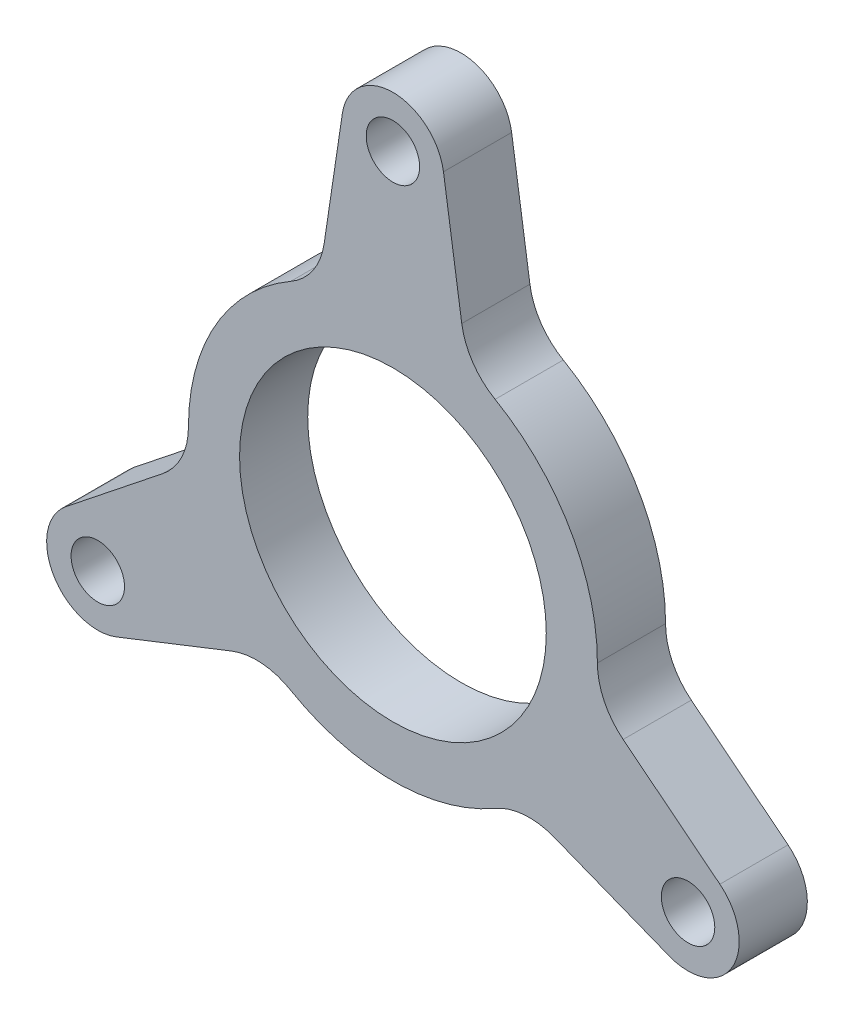
ISO-10303-21;
HEADER;
FILE_DESCRIPTION(('STEP AP214'),'2;1');
FILE_NAME('part.step','',(''),(''),'','','');
FILE_SCHEMA(('AUTOMOTIVE_DESIGN { 1 0 10303 214 1 1 1 1 }'));
ENDSEC;
DATA;
#1=APPLICATION_CONTEXT('core data for automotive mechanical design processes');
#2=APPLICATION_PROTOCOL_DEFINITION('international standard','automotive_design',2000,#1);
#3=PRODUCT_CONTEXT('',#1,'mechanical');
#4=PRODUCT('Part','Part','',(#3));
#5=PRODUCT_RELATED_PRODUCT_CATEGORY('part','',(#4));
#6=PRODUCT_DEFINITION_FORMATION('','',#4);
#7=PRODUCT_DEFINITION_CONTEXT('part definition',#1,'design');
#8=PRODUCT_DEFINITION('design','',#6,#7);
#9=PRODUCT_DEFINITION_SHAPE('','',#8);
#10=(LENGTH_UNIT() NAMED_UNIT(*) SI_UNIT(.MILLI.,.METRE.));
#11=(NAMED_UNIT(*) PLANE_ANGLE_UNIT() SI_UNIT($,.RADIAN.));
#12=(NAMED_UNIT(*) SI_UNIT($,.STERADIAN.) SOLID_ANGLE_UNIT());
#13=UNCERTAINTY_MEASURE_WITH_UNIT(LENGTH_MEASURE(1.E-05),#10,'distance_accuracy_value','');
#14=(GEOMETRIC_REPRESENTATION_CONTEXT(3) GLOBAL_UNCERTAINTY_ASSIGNED_CONTEXT((#13)) GLOBAL_UNIT_ASSIGNED_CONTEXT((#10,
#11,#12)) REPRESENTATION_CONTEXT('',''));
#15=CARTESIAN_POINT('',(0.,0.,0.));
#16=DIRECTION('',(0.,0.,1.));
#17=DIRECTION('',(1.,0.,0.));
#18=AXIS2_PLACEMENT_3D('',#15,#16,#17);
#19=CARTESIAN_POINT('',(0.,0.,6.35));
#20=DIRECTION('',(0.,0.,-1.));
#21=DIRECTION('',(-1.,0.,0.));
#22=AXIS2_PLACEMENT_3D('',#19,#20,#21);
#23=CYLINDRICAL_SURFACE('',#22,19.05);
#24=CARTESIAN_POINT('',(0.,0.,6.35));
#25=DIRECTION('',(0.,0.,1.));
#26=DIRECTION('',(1.,0.,0.));
#27=AXIS2_PLACEMENT_3D('',#24,#25,#26);
#28=CIRCLE('',#27,19.05);
#29=CARTESIAN_POINT('',(19.0499990058117,-0.00615455702048483,6.35));
#30=VERTEX_POINT('',#29);
#31=CARTESIAN_POINT('',(9.51966950017709,16.5008603596115,6.35));
#32=VERTEX_POINT('',#31);
#33=EDGE_CURVE('E185',#30,#32,#28,.T.);
#34=ORIENTED_EDGE('',*,*,#33,.F.);
#35=DIRECTION('',(0.,0.,-1.));
#36=VECTOR('',#35,1.);
#37=CARTESIAN_POINT('',(19.0499990058117,-0.00615455702048483,6.35));
#38=LINE('',#37,#36);
#39=CARTESIAN_POINT('',(19.0499990058117,-0.00615455702048483,0.));
#40=VERTEX_POINT('',#39);
#41=EDGE_CURVE('E269',#30,#40,#38,.T.);
#42=ORIENTED_EDGE('',*,*,#41,.T.);
#43=CARTESIAN_POINT('',(0.,0.,0.));
#44=DIRECTION('',(0.,0.,1.));
#45=DIRECTION('',(1.,0.,0.));
#46=AXIS2_PLACEMENT_3D('',#43,#44,#45);
#47=CIRCLE('',#46,19.05);
#48=CARTESIAN_POINT('',(9.51966950017709,16.5008603596115,0.));
#49=VERTEX_POINT('',#48);
#50=EDGE_CURVE('E222',#40,#49,#47,.T.);
#51=ORIENTED_EDGE('',*,*,#50,.T.);
#52=DIRECTION('',(0.,0.,-1.));
#53=VECTOR('',#52,1.);
#54=CARTESIAN_POINT('',(9.51966950017709,16.5008603596115,6.35));
#55=LINE('',#54,#53);
#56=EDGE_CURVE('E171',#49,#32,#55,.F.);
#57=ORIENTED_EDGE('',*,*,#56,.T.);
#58=EDGE_LOOP('',(#34,#42,#51,#57));
#59=FACE_BOUND('',#58,.T.);
#60=ADVANCED_FACE('F39',(#59),#23,.T.);
#61=CARTESIAN_POINT('',(9.3515888617346,1.39760431959159,6.35));
#62=DIRECTION('',(0.989015863361917,0.147809411129611,0.));
#63=DIRECTION('',(-0.147809411129611,0.989015863361917,0.));
#64=AXIS2_PLACEMENT_3D('',#61,#62,#63);
#65=PLANE('',#64);
#66=DIRECTION('',(0.147809411129611,-0.989015863361917,0.));
#67=VECTOR('',#66,1.);
#68=CARTESIAN_POINT('',(9.3515888617346,1.39760431959159,6.35));
#69=LINE('',#68,#67);
#70=CARTESIAN_POINT('',(4.71018804926113,32.4539423205048,6.35));
#71=VERTEX_POINT('',#70);
#72=CARTESIAN_POINT('',(6.41264193455461,21.0625573854756,6.35));
#73=VERTEX_POINT('',#72);
#74=EDGE_CURVE('E166',#71,#73,#69,.T.);
#75=ORIENTED_EDGE('',*,*,#74,.T.);
#76=DIRECTION('',(0.,0.,-1.));
#77=VECTOR('',#76,1.);
#78=CARTESIAN_POINT('',(6.41264193455461,21.0625573854756,6.35));
#79=LINE('',#78,#77);
#80=CARTESIAN_POINT('',(6.41264193455461,21.0625573854756,0.));
#81=VERTEX_POINT('',#80);
#82=EDGE_CURVE('E294',#73,#81,#79,.T.);
#83=ORIENTED_EDGE('',*,*,#82,.T.);
#84=DIRECTION('',(0.147809411129611,-0.989015863361917,0.));
#85=VECTOR('',#84,1.);
#86=CARTESIAN_POINT('',(9.3515888617346,1.39760431959159,0.));
#87=LINE('',#86,#85);
#88=CARTESIAN_POINT('',(4.71018804926113,32.4539423205048,0.));
#89=VERTEX_POINT('',#88);
#90=EDGE_CURVE('E168',#89,#81,#87,.T.);
#91=ORIENTED_EDGE('',*,*,#90,.F.);
#92=DIRECTION('',(0.,0.,-1.));
#93=VECTOR('',#92,1.);
#94=CARTESIAN_POINT('',(4.71018804926113,32.4539423205048,6.35));
#95=LINE('',#94,#93);
#96=EDGE_CURVE('E163',#71,#89,#95,.T.);
#97=ORIENTED_EDGE('',*,*,#96,.F.);
#98=EDGE_LOOP('',(#75,#83,#91,#97));
#99=FACE_BOUND('',#98,.T.);
#100=ADVANCED_FACE('F165',(#99),#65,.T.);
#101=CARTESIAN_POINT('',(0.,31.75,6.35));
#102=DIRECTION('',(0.,0.,-1.));
#103=DIRECTION('',(-1.,0.,0.));
#104=AXIS2_PLACEMENT_3D('',#101,#102,#103);
#105=CYLINDRICAL_SURFACE('',#104,4.7625);
#106=CARTESIAN_POINT('',(0.,31.75,0.));
#107=DIRECTION('',(0.,0.,1.));
#108=DIRECTION('',(1.,0.,0.));
#109=AXIS2_PLACEMENT_3D('',#106,#107,#108);
#110=CIRCLE('',#109,4.7625);
#111=CARTESIAN_POINT('',(-4.71018804926113,32.4539423205048,0.));
#112=VERTEX_POINT('',#111);
#113=EDGE_CURVE('E230',#89,#112,#110,.T.);
#114=ORIENTED_EDGE('',*,*,#113,.T.);
#115=DIRECTION('',(0.,0.,-1.));
#116=VECTOR('',#115,1.);
#117=CARTESIAN_POINT('',(-4.71018804926113,32.4539423205048,6.35));
#118=LINE('',#117,#116);
#119=CARTESIAN_POINT('',(-4.71018804926113,32.4539423205048,6.35));
#120=VERTEX_POINT('',#119);
#121=EDGE_CURVE('E172',#120,#112,#118,.T.);
#122=ORIENTED_EDGE('',*,*,#121,.F.);
#123=CARTESIAN_POINT('',(0.,31.75,6.35));
#124=DIRECTION('',(0.,0.,1.));
#125=DIRECTION('',(1.,0.,0.));
#126=AXIS2_PLACEMENT_3D('',#123,#124,#125);
#127=CIRCLE('',#126,4.7625);
#128=EDGE_CURVE('E175',#71,#120,#127,.T.);
#129=ORIENTED_EDGE('',*,*,#128,.F.);
#130=ORIENTED_EDGE('',*,*,#96,.T.);
#131=EDGE_LOOP('',(#114,#122,#129,#130));
#132=FACE_BOUND('',#131,.T.);
#133=ADVANCED_FACE('F176',(#132),#105,.T.);
#134=CARTESIAN_POINT('',(-9.35158886173458,1.39760431959158,6.35));
#135=DIRECTION('',(0.989015863361917,-0.147809411129611,0.));
#136=DIRECTION('',(0.147809411129611,0.989015863361917,0.));
#137=AXIS2_PLACEMENT_3D('',#134,#135,#136);
#138=PLANE('',#137);
#139=DIRECTION('',(-0.147809411129611,-0.989015863361917,0.));
#140=VECTOR('',#139,1.);
#141=CARTESIAN_POINT('',(-9.35158886173458,1.39760431959158,0.));
#142=LINE('',#141,#140);
#143=CARTESIAN_POINT('',(-6.4126419345546,21.0625573854756,0.));
#144=VERTEX_POINT('',#143);
#145=EDGE_CURVE('E227',#112,#144,#142,.T.);
#146=ORIENTED_EDGE('',*,*,#145,.T.);
#147=DIRECTION('',(0.,0.,1.));
#148=VECTOR('',#147,1.);
#149=CARTESIAN_POINT('',(-6.4126419345546,21.0625573854756,6.35));
#150=LINE('',#149,#148);
#151=CARTESIAN_POINT('',(-6.4126419345546,21.0625573854756,6.35));
#152=VERTEX_POINT('',#151);
#153=EDGE_CURVE('E292',#144,#152,#150,.T.);
#154=ORIENTED_EDGE('',*,*,#153,.T.);
#155=DIRECTION('',(-0.147809411129611,-0.989015863361917,0.));
#156=VECTOR('',#155,1.);
#157=CARTESIAN_POINT('',(-9.35158886173458,1.39760431959158,6.35));
#158=LINE('',#157,#156);
#159=EDGE_CURVE('E180',#120,#152,#158,.T.);
#160=ORIENTED_EDGE('',*,*,#159,.F.);
#161=ORIENTED_EDGE('',*,*,#121,.T.);
#162=EDGE_LOOP('',(#146,#154,#160,#161));
#163=FACE_BOUND('',#162,.T.);
#164=ADVANCED_FACE('F342',(#163),#138,.F.);
#165=CARTESIAN_POINT('',(-9.51966950017708,16.5008603596115,0.));
#166=VERTEX_POINT('',#165);
#167=CARTESIAN_POINT('',(-19.0499990058117,-0.00615455702049654,0.));
#168=VERTEX_POINT('',#167);
#169=EDGE_CURVE('E223',#166,#168,#47,.T.);
#170=ORIENTED_EDGE('',*,*,#169,.T.);
#171=DIRECTION('',(0.,0.,-1.));
#172=VECTOR('',#171,1.);
#173=CARTESIAN_POINT('',(-19.0499990058117,-0.00615455702049654,6.35));
#174=LINE('',#173,#172);
#175=CARTESIAN_POINT('',(-19.0499990058117,-0.00615455702049654,6.35));
#176=VERTEX_POINT('',#175);
#177=EDGE_CURVE('E290',#168,#176,#174,.F.);
#178=ORIENTED_EDGE('',*,*,#177,.T.);
#179=CARTESIAN_POINT('',(-9.51966950017708,16.5008603596115,6.35));
#180=VERTEX_POINT('',#179);
#181=EDGE_CURVE('E189',#180,#176,#28,.T.);
#182=ORIENTED_EDGE('',*,*,#181,.F.);
#183=DIRECTION('',(0.,0.,-1.));
#184=VECTOR('',#183,1.);
#185=CARTESIAN_POINT('',(-9.51966950017708,16.5008603596115,6.35));
#186=LINE('',#185,#184);
#187=EDGE_CURVE('E287',#180,#166,#186,.T.);
#188=ORIENTED_EDGE('',*,*,#187,.T.);
#189=EDGE_LOOP('',(#170,#178,#182,#188));
#190=FACE_BOUND('',#189,.T.);
#191=ADVANCED_FACE('F332',(#190),#23,.T.);
#192=CARTESIAN_POINT('',(-5.88615527607248,7.39991136021396,6.35));
#193=DIRECTION('',(-0.62251463663762,0.782608156852413,0.));
#194=DIRECTION('',(-0.782608156852413,-0.62251463663762,0.));
#195=AXIS2_PLACEMENT_3D('',#192,#193,#194);
#196=PLANE('',#195);
#197=DIRECTION('',(0.782608156852413,0.62251463663762,0.));
#198=VECTOR('',#197,1.);
#199=CARTESIAN_POINT('',(-5.88615527607248,7.39991136021396,6.35));
#200=LINE('',#199,#198);
#201=CARTESIAN_POINT('',(-30.4610325271426,-12.1478286529904,6.35));
#202=VERTEX_POINT('',#201);
#203=CARTESIAN_POINT('',(-21.4470307317668,-4.97776787204015,6.35));
#204=VERTEX_POINT('',#203);
#205=EDGE_CURVE('E194',#202,#204,#200,.T.);
#206=ORIENTED_EDGE('',*,*,#205,.T.);
#207=DIRECTION('',(0.,0.,-1.));
#208=VECTOR('',#207,1.);
#209=CARTESIAN_POINT('',(-21.4470307317668,-4.97776787204015,6.35));
#210=LINE('',#209,#208);
#211=CARTESIAN_POINT('',(-21.4470307317668,-4.97776787204015,0.));
#212=VERTEX_POINT('',#211);
#213=EDGE_CURVE('E284',#204,#212,#210,.T.);
#214=ORIENTED_EDGE('',*,*,#213,.T.);
#215=DIRECTION('',(0.782608156852413,0.62251463663762,0.));
#216=VECTOR('',#215,1.);
#217=CARTESIAN_POINT('',(-5.88615527607248,7.39991136021396,0.));
#218=LINE('',#217,#216);
#219=CARTESIAN_POINT('',(-30.4610325271426,-12.1478286529904,0.));
#220=VERTEX_POINT('',#219);
#221=EDGE_CURVE('E226',#220,#212,#218,.T.);
#222=ORIENTED_EDGE('',*,*,#221,.F.);
#223=DIRECTION('',(0.,0.,-1.));
#224=VECTOR('',#223,1.);
#225=CARTESIAN_POINT('',(-30.4610325271426,-12.1478286529904,6.35));
#226=LINE('',#225,#224);
#227=EDGE_CURVE('E265',#202,#220,#226,.T.);
#228=ORIENTED_EDGE('',*,*,#227,.F.);
#229=EDGE_LOOP('',(#206,#214,#222,#228));
#230=FACE_BOUND('',#229,.T.);
#231=ADVANCED_FACE('F341',(#230),#196,.T.);
#232=CARTESIAN_POINT('',(-27.4963065701559,-15.875,6.35));
#233=DIRECTION('',(0.,0.,-1.));
#234=DIRECTION('',(-1.,0.,0.));
#235=AXIS2_PLACEMENT_3D('',#232,#233,#234);
#236=CYLINDRICAL_SURFACE('',#235,4.7625);
#237=CARTESIAN_POINT('',(-27.4963065701559,-15.875,0.));
#238=DIRECTION('',(0.,0.,1.));
#239=DIRECTION('',(1.,0.,0.));
#240=AXIS2_PLACEMENT_3D('',#237,#238,#239);
#241=CIRCLE('',#240,4.7625);
#242=CARTESIAN_POINT('',(-25.7508444778815,-20.3061136675144,0.));
#243=VERTEX_POINT('',#242);
#244=EDGE_CURVE('E236',#220,#243,#241,.T.);
#245=ORIENTED_EDGE('',*,*,#244,.T.);
#246=DIRECTION('',(0.,0.,-1.));
#247=VECTOR('',#246,1.);
#248=CARTESIAN_POINT('',(-25.7508444778815,-20.3061136675144,6.35));
#249=LINE('',#248,#247);
#250=CARTESIAN_POINT('',(-25.7508444778815,-20.3061136675144,6.35));
#251=VERTEX_POINT('',#250);
#252=EDGE_CURVE('E262',#251,#243,#249,.T.);
#253=ORIENTED_EDGE('',*,*,#252,.F.);
#254=CARTESIAN_POINT('',(-27.4963065701559,-15.875,6.35));
#255=DIRECTION('',(0.,0.,1.));
#256=DIRECTION('',(1.,0.,0.));
#257=AXIS2_PLACEMENT_3D('',#254,#255,#256);
#258=CIRCLE('',#257,4.7625);
#259=EDGE_CURVE('E197',#202,#251,#258,.T.);
#260=ORIENTED_EDGE('',*,*,#259,.F.);
#261=ORIENTED_EDGE('',*,*,#227,.T.);
#262=EDGE_LOOP('',(#245,#253,#260,#261));
#263=FACE_BOUND('',#262,.T.);
#264=ADVANCED_FACE('F354',(#263),#236,.T.);
#265=CARTESIAN_POINT('',(3.46543358566212,-8.79751567980554,6.35));
#266=DIRECTION('',(-0.366501226724297,0.930417567982024,0.));
#267=DIRECTION('',(-0.930417567982025,-0.366501226724297,0.));
#268=AXIS2_PLACEMENT_3D('',#265,#266,#267);
#269=PLANE('',#268);
#270=DIRECTION('',(0.930417567982025,0.366501226724297,0.));
#271=VECTOR('',#270,1.);
#272=CARTESIAN_POINT('',(3.46543358566212,-8.79751567980554,0.));
#273=LINE('',#272,#271);
#274=CARTESIAN_POINT('',(-15.0343887972121,-16.0847895134355,0.));
#275=VERTEX_POINT('',#274);
#276=EDGE_CURVE('E238',#243,#275,#273,.T.);
#277=ORIENTED_EDGE('',*,*,#276,.T.);
#278=DIRECTION('',(0.,0.,1.));
#279=VECTOR('',#278,1.);
#280=CARTESIAN_POINT('',(-15.0343887972121,-16.0847895134355,6.35));
#281=LINE('',#280,#279);
#282=CARTESIAN_POINT('',(-15.0343887972121,-16.0847895134355,6.35));
#283=VERTEX_POINT('',#282);
#284=EDGE_CURVE('E282',#275,#283,#281,.T.);
#285=ORIENTED_EDGE('',*,*,#284,.T.);
#286=DIRECTION('',(0.930417567982025,0.366501226724297,0.));
#287=VECTOR('',#286,1.);
#288=CARTESIAN_POINT('',(3.46543358566212,-8.79751567980554,6.35));
#289=LINE('',#288,#287);
#290=EDGE_CURVE('E199',#251,#283,#289,.T.);
#291=ORIENTED_EDGE('',*,*,#290,.F.);
#292=ORIENTED_EDGE('',*,*,#252,.T.);
#293=EDGE_LOOP('',(#277,#285,#291,#292));
#294=FACE_BOUND('',#293,.T.);
#295=ADVANCED_FACE('F346',(#294),#269,.F.);
#296=CARTESIAN_POINT('',(-9.53032950563464,-16.494705802591,0.));
#297=VERTEX_POINT('',#296);
#298=CARTESIAN_POINT('',(9.53032950563464,-16.494705802591,0.));
#299=VERTEX_POINT('',#298);
#300=EDGE_CURVE('E228',#297,#299,#47,.T.);
#301=ORIENTED_EDGE('',*,*,#300,.T.);
#302=DIRECTION('',(0.,0.,-1.));
#303=VECTOR('',#302,1.);
#304=CARTESIAN_POINT('',(9.53032950563464,-16.494705802591,6.35));
#305=LINE('',#304,#303);
#306=CARTESIAN_POINT('',(9.53032950563464,-16.494705802591,6.35));
#307=VERTEX_POINT('',#306);
#308=EDGE_CURVE('E280',#299,#307,#305,.F.);
#309=ORIENTED_EDGE('',*,*,#308,.T.);
#310=CARTESIAN_POINT('',(-9.53032950563464,-16.494705802591,6.35));
#311=VERTEX_POINT('',#310);
#312=EDGE_CURVE('E190',#311,#307,#28,.T.);
#313=ORIENTED_EDGE('',*,*,#312,.F.);
#314=DIRECTION('',(0.,0.,-1.));
#315=VECTOR('',#314,1.);
#316=CARTESIAN_POINT('',(-9.53032950563464,-16.494705802591,6.35));
#317=LINE('',#316,#315);
#318=EDGE_CURVE('E277',#311,#297,#317,.T.);
#319=ORIENTED_EDGE('',*,*,#318,.T.);
#320=EDGE_LOOP('',(#301,#309,#313,#319));
#321=FACE_BOUND('',#320,.T.);
#322=ADVANCED_FACE('F333',(#321),#23,.T.);
#323=CARTESIAN_POINT('',(-3.46543358566211,-8.79751567980557,6.35));
#324=DIRECTION('',(-0.366501226724296,-0.930417567982025,0.));
#325=DIRECTION('',(0.930417567982025,-0.366501226724296,0.));
#326=AXIS2_PLACEMENT_3D('',#323,#324,#325);
#327=PLANE('',#326);
#328=DIRECTION('',(-0.930417567982025,0.366501226724296,0.));
#329=VECTOR('',#328,1.);
#330=CARTESIAN_POINT('',(-3.46543358566211,-8.79751567980557,6.35));
#331=LINE('',#330,#329);
#332=CARTESIAN_POINT('',(25.7508444778815,-20.3061136675144,6.35));
#333=VERTEX_POINT('',#332);
#334=CARTESIAN_POINT('',(15.0343887972121,-16.0847895134355,6.35));
#335=VERTEX_POINT('',#334);
#336=EDGE_CURVE('E202',#333,#335,#331,.T.);
#337=ORIENTED_EDGE('',*,*,#336,.T.);
#338=DIRECTION('',(0.,0.,-1.));
#339=VECTOR('',#338,1.);
#340=CARTESIAN_POINT('',(15.0343887972121,-16.0847895134355,6.35));
#341=LINE('',#340,#339);
#342=CARTESIAN_POINT('',(15.0343887972121,-16.0847895134355,0.));
#343=VERTEX_POINT('',#342);
#344=EDGE_CURVE('E274',#335,#343,#341,.T.);
#345=ORIENTED_EDGE('',*,*,#344,.T.);
#346=DIRECTION('',(-0.930417567982025,0.366501226724296,0.));
#347=VECTOR('',#346,1.);
#348=CARTESIAN_POINT('',(-3.46543358566211,-8.79751567980557,0.));
#349=LINE('',#348,#347);
#350=CARTESIAN_POINT('',(25.7508444778815,-20.3061136675144,0.));
#351=VERTEX_POINT('',#350);
#352=EDGE_CURVE('E241',#351,#343,#349,.T.);
#353=ORIENTED_EDGE('',*,*,#352,.F.);
#354=DIRECTION('',(0.,0.,-1.));
#355=VECTOR('',#354,1.);
#356=CARTESIAN_POINT('',(25.7508444778815,-20.3061136675144,6.35));
#357=LINE('',#356,#355);
#358=EDGE_CURVE('E260',#333,#351,#357,.T.);
#359=ORIENTED_EDGE('',*,*,#358,.F.);
#360=EDGE_LOOP('',(#337,#345,#353,#359));
#361=FACE_BOUND('',#360,.T.);
#362=ADVANCED_FACE('F345',(#361),#327,.T.);
#363=CARTESIAN_POINT('',(27.4963065701559,-15.875,6.35));
#364=DIRECTION('',(0.,0.,-1.));
#365=DIRECTION('',(-1.,0.,0.));
#366=AXIS2_PLACEMENT_3D('',#363,#364,#365);
#367=CYLINDRICAL_SURFACE('',#366,4.7625);
#368=CARTESIAN_POINT('',(27.4963065701559,-15.875,0.));
#369=DIRECTION('',(0.,0.,1.));
#370=DIRECTION('',(1.,0.,0.));
#371=AXIS2_PLACEMENT_3D('',#368,#369,#370);
#372=CIRCLE('',#371,4.7625);
#373=CARTESIAN_POINT('',(30.4610325271426,-12.1478286529904,0.));
#374=VERTEX_POINT('',#373);
#375=EDGE_CURVE('E244',#351,#374,#372,.T.);
#376=ORIENTED_EDGE('',*,*,#375,.T.);
#377=DIRECTION('',(0.,0.,-1.));
#378=VECTOR('',#377,1.);
#379=CARTESIAN_POINT('',(30.4610325271426,-12.1478286529904,6.35));
#380=LINE('',#379,#378);
#381=CARTESIAN_POINT('',(30.4610325271426,-12.1478286529904,6.35));
#382=VERTEX_POINT('',#381);
#383=EDGE_CURVE('E218',#382,#374,#380,.T.);
#384=ORIENTED_EDGE('',*,*,#383,.F.);
#385=CARTESIAN_POINT('',(27.4963065701559,-15.875,6.35));
#386=DIRECTION('',(0.,0.,1.));
#387=DIRECTION('',(1.,0.,0.));
#388=AXIS2_PLACEMENT_3D('',#385,#386,#387);
#389=CIRCLE('',#388,4.7625);
#390=EDGE_CURVE('E205',#333,#382,#389,.T.);
#391=ORIENTED_EDGE('',*,*,#390,.F.);
#392=ORIENTED_EDGE('',*,*,#358,.T.);
#393=EDGE_LOOP('',(#376,#384,#391,#392));
#394=FACE_BOUND('',#393,.T.);
#395=ADVANCED_FACE('F352',(#394),#367,.T.);
#396=CARTESIAN_POINT('',(-27.4963065701559,-15.875,6.35));
#397=DIRECTION('',(0.,0.,-1.));
#398=DIRECTION('',(-1.,0.,0.));
#399=AXIS2_PLACEMENT_3D('',#396,#397,#398);
#400=CYLINDRICAL_SURFACE('',#399,2.4892);
#401=CARTESIAN_POINT('',(-27.4963065701559,-15.875,6.35));
#402=DIRECTION('',(0.,0.,1.));
#403=DIRECTION('',(1.,0.,0.));
#404=AXIS2_PLACEMENT_3D('',#401,#402,#403);
#405=CIRCLE('',#404,2.4892);
#406=CARTESIAN_POINT('',(-25.0071065701559,-15.875,6.35));
#407=VERTEX_POINT('',#406);
#408=EDGE_CURVE('E212',#407,#407,#405,.T.);
#409=ORIENTED_EDGE('',*,*,#408,.T.);
#410=EDGE_LOOP('',(#409));
#411=FACE_BOUND('',#410,.T.);
#412=CARTESIAN_POINT('',(-27.4963065701559,-15.875,0.));
#413=DIRECTION('',(0.,0.,1.));
#414=DIRECTION('',(1.,0.,0.));
#415=AXIS2_PLACEMENT_3D('',#412,#413,#414);
#416=CIRCLE('',#415,2.4892);
#417=CARTESIAN_POINT('',(-25.0071065701559,-15.875,0.));
#418=VERTEX_POINT('',#417);
#419=EDGE_CURVE('E252',#418,#418,#416,.T.);
#420=ORIENTED_EDGE('',*,*,#419,.F.);
#421=EDGE_LOOP('',(#420));
#422=FACE_BOUND('',#421,.T.);
#423=ADVANCED_FACE('F391',(#411,#422),#400,.F.);
#424=CARTESIAN_POINT('',(0.,31.75,6.35));
#425=DIRECTION('',(0.,0.,-1.));
#426=DIRECTION('',(-1.,0.,0.));
#427=AXIS2_PLACEMENT_3D('',#424,#425,#426);
#428=CYLINDRICAL_SURFACE('',#427,2.4892);
#429=CARTESIAN_POINT('',(0.,31.75,6.35));
#430=DIRECTION('',(0.,0.,1.));
#431=DIRECTION('',(1.,0.,0.));
#432=AXIS2_PLACEMENT_3D('',#429,#430,#431);
#433=CIRCLE('',#432,2.4892);
#434=CARTESIAN_POINT('',(2.4892,31.75,6.35));
#435=VERTEX_POINT('',#434);
#436=EDGE_CURVE('E209',#435,#435,#433,.T.);
#437=ORIENTED_EDGE('',*,*,#436,.T.);
#438=EDGE_LOOP('',(#437));
#439=FACE_BOUND('',#438,.T.);
#440=CARTESIAN_POINT('',(0.,31.75,0.));
#441=DIRECTION('',(0.,0.,1.));
#442=DIRECTION('',(1.,0.,0.));
#443=AXIS2_PLACEMENT_3D('',#440,#441,#442);
#444=CIRCLE('',#443,2.4892);
#445=CARTESIAN_POINT('',(2.4892,31.75,0.));
#446=VERTEX_POINT('',#445);
#447=EDGE_CURVE('E249',#446,#446,#444,.T.);
#448=ORIENTED_EDGE('',*,*,#447,.F.);
#449=EDGE_LOOP('',(#448));
#450=FACE_BOUND('',#449,.T.);
#451=ADVANCED_FACE('F382',(#439,#450),#428,.F.);
#452=CARTESIAN_POINT('',(5.88615527607247,7.39991136021396,6.35));
#453=DIRECTION('',(-0.622514636637619,-0.782608156852414,0.));
#454=DIRECTION('',(0.782608156852414,-0.62251463663762,0.));
#455=AXIS2_PLACEMENT_3D('',#452,#453,#454);
#456=PLANE('',#455);
#457=DIRECTION('',(-0.782608156852414,0.622514636637619,0.));
#458=VECTOR('',#457,1.);
#459=CARTESIAN_POINT('',(5.88615527607247,7.39991136021396,0.));
#460=LINE('',#459,#458);
#461=CARTESIAN_POINT('',(21.4470307317668,-4.97776787204014,0.));
#462=VERTEX_POINT('',#461);
#463=EDGE_CURVE('E246',#374,#462,#460,.T.);
#464=ORIENTED_EDGE('',*,*,#463,.T.);
#465=DIRECTION('',(0.,0.,1.));
#466=VECTOR('',#465,1.);
#467=CARTESIAN_POINT('',(21.4470307317668,-4.97776787204014,6.35));
#468=LINE('',#467,#466);
#469=CARTESIAN_POINT('',(21.4470307317668,-4.97776787204014,6.35));
#470=VERTEX_POINT('',#469);
#471=EDGE_CURVE('E272',#462,#470,#468,.T.);
#472=ORIENTED_EDGE('',*,*,#471,.T.);
#473=DIRECTION('',(-0.782608156852414,0.622514636637619,0.));
#474=VECTOR('',#473,1.);
#475=CARTESIAN_POINT('',(5.88615527607247,7.39991136021396,6.35));
#476=LINE('',#475,#474);
#477=EDGE_CURVE('E207',#382,#470,#476,.T.);
#478=ORIENTED_EDGE('',*,*,#477,.F.);
#479=ORIENTED_EDGE('',*,*,#383,.T.);
#480=EDGE_LOOP('',(#464,#472,#478,#479));
#481=FACE_BOUND('',#480,.T.);
#482=ADVANCED_FACE('F379',(#481),#456,.F.);
#483=CARTESIAN_POINT('',(0.,0.,6.35));
#484=DIRECTION('',(0.,0.,-1.));
#485=DIRECTION('',(-1.,0.,0.));
#486=AXIS2_PLACEMENT_3D('',#483,#484,#485);
#487=CYLINDRICAL_SURFACE('',#486,14.2875);
#488=CARTESIAN_POINT('',(0.,0.,6.35));
#489=DIRECTION('',(0.,0.,1.));
#490=DIRECTION('',(1.,0.,0.));
#491=AXIS2_PLACEMENT_3D('',#488,#489,#490);
#492=CIRCLE('',#491,14.2875);
#493=CARTESIAN_POINT('',(14.2875,0.,6.35));
#494=VERTEX_POINT('',#493);
#495=EDGE_CURVE('E187',#494,#494,#492,.T.);
#496=ORIENTED_EDGE('',*,*,#495,.T.);
#497=EDGE_LOOP('',(#496));
#498=FACE_BOUND('',#497,.T.);
#499=CARTESIAN_POINT('',(0.,0.,0.));
#500=DIRECTION('',(0.,0.,1.));
#501=DIRECTION('',(1.,0.,0.));
#502=AXIS2_PLACEMENT_3D('',#499,#500,#501);
#503=CIRCLE('',#502,14.2875);
#504=CARTESIAN_POINT('',(14.2875,0.,0.));
#505=VERTEX_POINT('',#504);
#506=EDGE_CURVE('E219',#505,#505,#503,.T.);
#507=ORIENTED_EDGE('',*,*,#506,.F.);
#508=EDGE_LOOP('',(#507));
#509=FACE_BOUND('',#508,.T.);
#510=ADVANCED_FACE('F381',(#498,#509),#487,.F.);
#511=CARTESIAN_POINT('',(27.4963065701559,-15.875,6.35));
#512=DIRECTION('',(0.,0.,-1.));
#513=DIRECTION('',(-1.,0.,0.));
#514=AXIS2_PLACEMENT_3D('',#511,#512,#513);
#515=CYLINDRICAL_SURFACE('',#514,2.4892);
#516=CARTESIAN_POINT('',(27.4963065701559,-15.875,6.35));
#517=DIRECTION('',(0.,0.,1.));
#518=DIRECTION('',(1.,0.,0.));
#519=AXIS2_PLACEMENT_3D('',#516,#517,#518);
#520=CIRCLE('',#519,2.4892);
#521=CARTESIAN_POINT('',(29.9855065701559,-15.875,6.35));
#522=VERTEX_POINT('',#521);
#523=EDGE_CURVE('E215',#522,#522,#520,.T.);
#524=ORIENTED_EDGE('',*,*,#523,.T.);
#525=EDGE_LOOP('',(#524));
#526=FACE_BOUND('',#525,.T.);
#527=CARTESIAN_POINT('',(27.4963065701559,-15.875,0.));
#528=DIRECTION('',(0.,0.,1.));
#529=DIRECTION('',(1.,0.,0.));
#530=AXIS2_PLACEMENT_3D('',#527,#528,#529);
#531=CIRCLE('',#530,2.4892);
#532=CARTESIAN_POINT('',(29.9855065701559,-15.875,0.));
#533=VERTEX_POINT('',#532);
#534=EDGE_CURVE('E255',#533,#533,#531,.T.);
#535=ORIENTED_EDGE('',*,*,#534,.F.);
#536=EDGE_LOOP('',(#535));
#537=FACE_BOUND('',#536,.T.);
#538=ADVANCED_FACE('F388',(#526,#537),#515,.F.);
#539=CARTESIAN_POINT('',(0.,0.,6.35));
#540=DIRECTION('',(0.,0.,1.));
#541=DIRECTION('',(1.,0.,0.));
#542=AXIS2_PLACEMENT_3D('',#539,#540,#541);
#543=PLANE('',#542);
#544=ORIENTED_EDGE('',*,*,#495,.F.);
#545=EDGE_LOOP('',(#544));
#546=FACE_BOUND('',#545,.T.);
#547=ORIENTED_EDGE('',*,*,#477,.T.);
#548=CARTESIAN_POINT('',(25.3999986744156,-0.0082060760273131,6.35));
#549=DIRECTION('',(0.,0.,1.));
#550=DIRECTION('',(1.,0.,0.));
#551=AXIS2_PLACEMENT_3D('',#548,#549,#550);
#552=CIRCLE('',#551,6.35);
#553=EDGE_CURVE('E298',#470,#30,#552,.F.);
#554=ORIENTED_EDGE('',*,*,#553,.T.);
#555=ORIENTED_EDGE('',*,*,#33,.T.);
#556=CARTESIAN_POINT('',(12.6928926669028,22.0011471461487,6.35));
#557=DIRECTION('',(0.,0.,1.));
#558=DIRECTION('',(1.,0.,0.));
#559=AXIS2_PLACEMENT_3D('',#556,#557,#558);
#560=CIRCLE('',#559,6.35);
#561=EDGE_CURVE('E11',#32,#73,#560,.F.);
#562=ORIENTED_EDGE('',*,*,#561,.T.);
#563=ORIENTED_EDGE('',*,*,#74,.F.);
#564=ORIENTED_EDGE('',*,*,#128,.T.);
#565=ORIENTED_EDGE('',*,*,#159,.T.);
#566=CARTESIAN_POINT('',(-12.6928926669028,22.0011471461487,6.35));
#567=DIRECTION('',(0.,0.,1.));
#568=DIRECTION('',(1.,0.,0.));
#569=AXIS2_PLACEMENT_3D('',#566,#567,#568);
#570=CIRCLE('',#569,6.35);
#571=EDGE_CURVE('E314',#152,#180,#570,.F.);
#572=ORIENTED_EDGE('',*,*,#571,.T.);
#573=ORIENTED_EDGE('',*,*,#181,.T.);
#574=CARTESIAN_POINT('',(-25.3999986744156,-0.00820607602732872,6.35));
#575=DIRECTION('',(0.,0.,1.));
#576=DIRECTION('',(1.,0.,0.));
#577=AXIS2_PLACEMENT_3D('',#574,#575,#576);
#578=CIRCLE('',#577,6.35);
#579=EDGE_CURVE('E310',#176,#204,#578,.F.);
#580=ORIENTED_EDGE('',*,*,#579,.T.);
#581=ORIENTED_EDGE('',*,*,#205,.F.);
#582=ORIENTED_EDGE('',*,*,#259,.T.);
#583=ORIENTED_EDGE('',*,*,#290,.T.);
#584=CARTESIAN_POINT('',(-12.7071060075129,-21.9929410701214,6.35));
#585=DIRECTION('',(0.,0.,1.));
#586=DIRECTION('',(1.,0.,0.));
#587=AXIS2_PLACEMENT_3D('',#584,#585,#586);
#588=CIRCLE('',#587,6.35);
#589=EDGE_CURVE('E306',#283,#311,#588,.F.);
#590=ORIENTED_EDGE('',*,*,#589,.T.);
#591=ORIENTED_EDGE('',*,*,#312,.T.);
#592=CARTESIAN_POINT('',(12.7071060075129,-21.9929410701214,6.35));
#593=DIRECTION('',(0.,0.,1.));
#594=DIRECTION('',(1.,0.,0.));
#595=AXIS2_PLACEMENT_3D('',#592,#593,#594);
#596=CIRCLE('',#595,6.35);
#597=EDGE_CURVE('E302',#307,#335,#596,.F.);
#598=ORIENTED_EDGE('',*,*,#597,.T.);
#599=ORIENTED_EDGE('',*,*,#336,.F.);
#600=ORIENTED_EDGE('',*,*,#390,.T.);
#601=EDGE_LOOP('',(#547,#554,#555,#562,#563,#564,#565,#572,#573,#580,#581,#582,#583,#590,#591,
#598,#599,#600));
#602=FACE_BOUND('',#601,.T.);
#603=ORIENTED_EDGE('',*,*,#436,.F.);
#604=EDGE_LOOP('',(#603));
#605=FACE_BOUND('',#604,.T.);
#606=ORIENTED_EDGE('',*,*,#408,.F.);
#607=EDGE_LOOP('',(#606));
#608=FACE_BOUND('',#607,.T.);
#609=ORIENTED_EDGE('',*,*,#523,.F.);
#610=EDGE_LOOP('',(#609));
#611=FACE_BOUND('',#610,.T.);
#612=ADVANCED_FACE('F183',(#546,#602,#605,#608,#611),#543,.T.);
#613=CARTESIAN_POINT('',(0.,0.,0.));
#614=DIRECTION('',(0.,0.,1.));
#615=DIRECTION('',(1.,0.,0.));
#616=AXIS2_PLACEMENT_3D('',#613,#614,#615);
#617=PLANE('',#616);
#618=ORIENTED_EDGE('',*,*,#506,.T.);
#619=EDGE_LOOP('',(#618));
#620=FACE_BOUND('',#619,.T.);
#621=ORIENTED_EDGE('',*,*,#50,.F.);
#622=CARTESIAN_POINT('',(25.3999986744156,-0.0082060760273131,0.));
#623=DIRECTION('',(0.,0.,1.));
#624=DIRECTION('',(1.,0.,0.));
#625=AXIS2_PLACEMENT_3D('',#622,#623,#624);
#626=CIRCLE('',#625,6.35);
#627=EDGE_CURVE('E296',#40,#462,#626,.T.);
#628=ORIENTED_EDGE('',*,*,#627,.T.);
#629=ORIENTED_EDGE('',*,*,#463,.F.);
#630=ORIENTED_EDGE('',*,*,#375,.F.);
#631=ORIENTED_EDGE('',*,*,#352,.T.);
#632=CARTESIAN_POINT('',(12.7071060075129,-21.9929410701214,0.));
#633=DIRECTION('',(0.,0.,1.));
#634=DIRECTION('',(1.,0.,0.));
#635=AXIS2_PLACEMENT_3D('',#632,#633,#634);
#636=CIRCLE('',#635,6.35);
#637=EDGE_CURVE('E300',#343,#299,#636,.T.);
#638=ORIENTED_EDGE('',*,*,#637,.T.);
#639=ORIENTED_EDGE('',*,*,#300,.F.);
#640=CARTESIAN_POINT('',(-12.7071060075129,-21.9929410701214,0.));
#641=DIRECTION('',(0.,0.,1.));
#642=DIRECTION('',(1.,0.,0.));
#643=AXIS2_PLACEMENT_3D('',#640,#641,#642);
#644=CIRCLE('',#643,6.35);
#645=EDGE_CURVE('E304',#297,#275,#644,.T.);
#646=ORIENTED_EDGE('',*,*,#645,.T.);
#647=ORIENTED_EDGE('',*,*,#276,.F.);
#648=ORIENTED_EDGE('',*,*,#244,.F.);
#649=ORIENTED_EDGE('',*,*,#221,.T.);
#650=CARTESIAN_POINT('',(-25.3999986744156,-0.00820607602732872,0.));
#651=DIRECTION('',(0.,0.,1.));
#652=DIRECTION('',(1.,0.,0.));
#653=AXIS2_PLACEMENT_3D('',#650,#651,#652);
#654=CIRCLE('',#653,6.35);
#655=EDGE_CURVE('E308',#212,#168,#654,.T.);
#656=ORIENTED_EDGE('',*,*,#655,.T.);
#657=ORIENTED_EDGE('',*,*,#169,.F.);
#658=CARTESIAN_POINT('',(-12.6928926669028,22.0011471461487,0.));
#659=DIRECTION('',(0.,0.,1.));
#660=DIRECTION('',(1.,0.,0.));
#661=AXIS2_PLACEMENT_3D('',#658,#659,#660);
#662=CIRCLE('',#661,6.35);
#663=EDGE_CURVE('E312',#166,#144,#662,.T.);
#664=ORIENTED_EDGE('',*,*,#663,.T.);
#665=ORIENTED_EDGE('',*,*,#145,.F.);
#666=ORIENTED_EDGE('',*,*,#113,.F.);
#667=ORIENTED_EDGE('',*,*,#90,.T.);
#668=CARTESIAN_POINT('',(12.6928926669028,22.0011471461487,0.));
#669=DIRECTION('',(0.,0.,1.));
#670=DIRECTION('',(1.,0.,0.));
#671=AXIS2_PLACEMENT_3D('',#668,#669,#670);
#672=CIRCLE('',#671,6.35);
#673=EDGE_CURVE('E47',#81,#49,#672,.T.);
#674=ORIENTED_EDGE('',*,*,#673,.T.);
#675=EDGE_LOOP('',(#621,#628,#629,#630,#631,#638,#639,#646,#647,#648,#649,#656,#657,#664,#665,
#666,#667,#674));
#676=FACE_BOUND('',#675,.T.);
#677=ORIENTED_EDGE('',*,*,#447,.T.);
#678=EDGE_LOOP('',(#677));
#679=FACE_BOUND('',#678,.T.);
#680=ORIENTED_EDGE('',*,*,#419,.T.);
#681=EDGE_LOOP('',(#680));
#682=FACE_BOUND('',#681,.T.);
#683=ORIENTED_EDGE('',*,*,#534,.T.);
#684=EDGE_LOOP('',(#683));
#685=FACE_BOUND('',#684,.T.);
#686=ADVANCED_FACE('F318',(#620,#676,#679,#682,#685),#617,.F.);
#687=CARTESIAN_POINT('',(25.3999986744156,-0.0082060760273131,6.35));
#688=DIRECTION('',(0.,0.,-1.));
#689=DIRECTION('',(-1.,0.,0.));
#690=AXIS2_PLACEMENT_3D('',#687,#688,#689);
#691=CYLINDRICAL_SURFACE('',#690,6.35);
#692=ORIENTED_EDGE('',*,*,#553,.F.);
#693=ORIENTED_EDGE('',*,*,#471,.F.);
#694=ORIENTED_EDGE('',*,*,#627,.F.);
#695=ORIENTED_EDGE('',*,*,#41,.F.);
#696=EDGE_LOOP('',(#692,#693,#694,#695));
#697=FACE_BOUND('',#696,.T.);
#698=ADVANCED_FACE('F377',(#697),#691,.F.);
#699=CARTESIAN_POINT('',(12.7071060075129,-21.9929410701214,6.35));
#700=DIRECTION('',(0.,0.,-1.));
#701=DIRECTION('',(-1.,0.,0.));
#702=AXIS2_PLACEMENT_3D('',#699,#700,#701);
#703=CYLINDRICAL_SURFACE('',#702,6.35);
#704=ORIENTED_EDGE('',*,*,#597,.F.);
#705=ORIENTED_EDGE('',*,*,#308,.F.);
#706=ORIENTED_EDGE('',*,*,#637,.F.);
#707=ORIENTED_EDGE('',*,*,#344,.F.);
#708=EDGE_LOOP('',(#704,#705,#706,#707));
#709=FACE_BOUND('',#708,.T.);
#710=ADVANCED_FACE('F364',(#709),#703,.F.);
#711=CARTESIAN_POINT('',(-12.7071060075129,-21.9929410701214,6.35));
#712=DIRECTION('',(0.,0.,-1.));
#713=DIRECTION('',(-1.,0.,0.));
#714=AXIS2_PLACEMENT_3D('',#711,#712,#713);
#715=CYLINDRICAL_SURFACE('',#714,6.35);
#716=ORIENTED_EDGE('',*,*,#589,.F.);
#717=ORIENTED_EDGE('',*,*,#284,.F.);
#718=ORIENTED_EDGE('',*,*,#645,.F.);
#719=ORIENTED_EDGE('',*,*,#318,.F.);
#720=EDGE_LOOP('',(#716,#717,#718,#719));
#721=FACE_BOUND('',#720,.T.);
#722=ADVANCED_FACE('F437',(#721),#715,.F.);
#723=CARTESIAN_POINT('',(-25.3999986744156,-0.00820607602732872,6.35));
#724=DIRECTION('',(0.,0.,-1.));
#725=DIRECTION('',(-1.,0.,0.));
#726=AXIS2_PLACEMENT_3D('',#723,#724,#725);
#727=CYLINDRICAL_SURFACE('',#726,6.35);
#728=ORIENTED_EDGE('',*,*,#579,.F.);
#729=ORIENTED_EDGE('',*,*,#177,.F.);
#730=ORIENTED_EDGE('',*,*,#655,.F.);
#731=ORIENTED_EDGE('',*,*,#213,.F.);
#732=EDGE_LOOP('',(#728,#729,#730,#731));
#733=FACE_BOUND('',#732,.T.);
#734=ADVANCED_FACE('F328',(#733),#727,.F.);
#735=CARTESIAN_POINT('',(-12.6928926669028,22.0011471461487,6.35));
#736=DIRECTION('',(0.,0.,-1.));
#737=DIRECTION('',(-1.,0.,0.));
#738=AXIS2_PLACEMENT_3D('',#735,#736,#737);
#739=CYLINDRICAL_SURFACE('',#738,6.35);
#740=ORIENTED_EDGE('',*,*,#571,.F.);
#741=ORIENTED_EDGE('',*,*,#153,.F.);
#742=ORIENTED_EDGE('',*,*,#663,.F.);
#743=ORIENTED_EDGE('',*,*,#187,.F.);
#744=EDGE_LOOP('',(#740,#741,#742,#743));
#745=FACE_BOUND('',#744,.T.);
#746=ADVANCED_FACE('F324',(#745),#739,.F.);
#747=CARTESIAN_POINT('',(12.6928926669028,22.0011471461487,6.35));
#748=DIRECTION('',(0.,0.,-1.));
#749=DIRECTION('',(-1.,0.,0.));
#750=AXIS2_PLACEMENT_3D('',#747,#748,#749);
#751=CYLINDRICAL_SURFACE('',#750,6.35);
#752=ORIENTED_EDGE('',*,*,#561,.F.);
#753=ORIENTED_EDGE('',*,*,#56,.F.);
#754=ORIENTED_EDGE('',*,*,#673,.F.);
#755=ORIENTED_EDGE('',*,*,#82,.F.);
#756=EDGE_LOOP('',(#752,#753,#754,#755));
#757=FACE_BOUND('',#756,.T.);
#758=ADVANCED_FACE('F41',(#757),#751,.F.);
#759=CLOSED_SHELL('',(#60,#100,#133,#164,#191,#231,#264,#295,#322,#362,#395,#423,#451,#482,#510,
#538,#612,#686,#698,#710,#722,#734,#746,#758));
#760=MANIFOLD_SOLID_BREP('B2',#759);
#761=ADVANCED_BREP_SHAPE_REPRESENTATION('',(#18,#760),#14);
#762=SHAPE_DEFINITION_REPRESENTATION(#9,#761);
ENDSEC;
END-ISO-10303-21;
